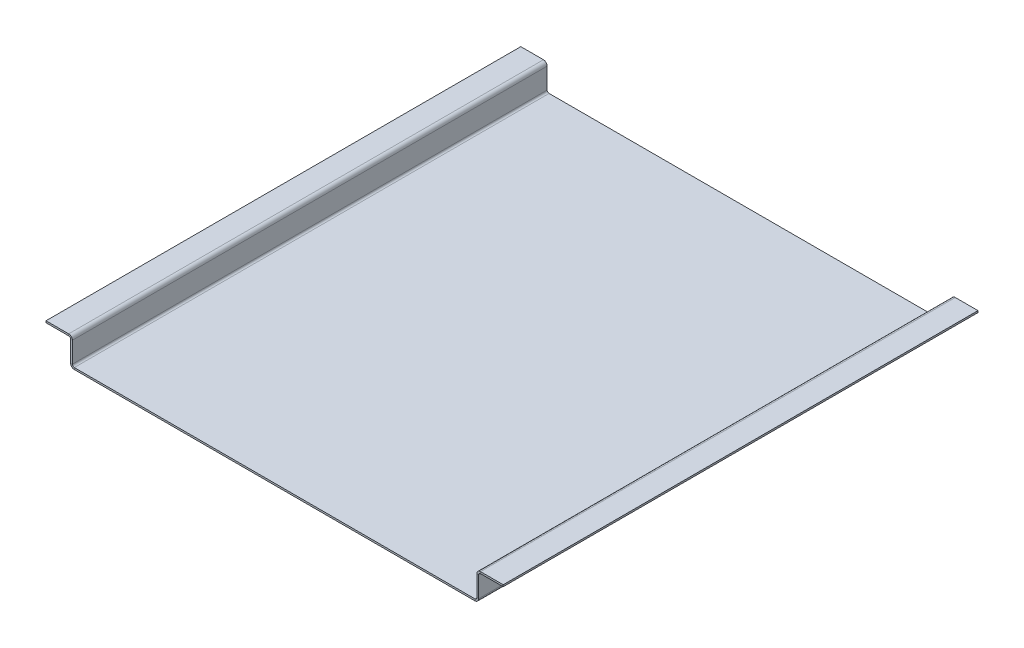
ISO-10303-21;
HEADER;
FILE_DESCRIPTION(('STEP AP214'),'2;1');
FILE_NAME('part.step','',(''),(''),'','','');
FILE_SCHEMA(('AUTOMOTIVE_DESIGN { 1 0 10303 214 1 1 1 1 }'));
ENDSEC;
DATA;
#1=APPLICATION_CONTEXT('core data for automotive mechanical design processes');
#2=APPLICATION_PROTOCOL_DEFINITION('international standard','automotive_design',2000,#1);
#3=PRODUCT_CONTEXT('',#1,'mechanical');
#4=PRODUCT('Part','Part','',(#3));
#5=PRODUCT_RELATED_PRODUCT_CATEGORY('part','',(#4));
#6=PRODUCT_DEFINITION_FORMATION('','',#4);
#7=PRODUCT_DEFINITION_CONTEXT('part definition',#1,'design');
#8=PRODUCT_DEFINITION('design','',#6,#7);
#9=PRODUCT_DEFINITION_SHAPE('','',#8);
#10=(LENGTH_UNIT() NAMED_UNIT(*) SI_UNIT(.MILLI.,.METRE.));
#11=(NAMED_UNIT(*) PLANE_ANGLE_UNIT() SI_UNIT($,.RADIAN.));
#12=(NAMED_UNIT(*) SI_UNIT($,.STERADIAN.) SOLID_ANGLE_UNIT());
#13=UNCERTAINTY_MEASURE_WITH_UNIT(LENGTH_MEASURE(1.E-05),#10,'distance_accuracy_value','');
#14=(GEOMETRIC_REPRESENTATION_CONTEXT(3) GLOBAL_UNCERTAINTY_ASSIGNED_CONTEXT((#13)) GLOBAL_UNIT_ASSIGNED_CONTEXT((#10,
#11,#12)) REPRESENTATION_CONTEXT('',''));
#15=CARTESIAN_POINT('',(0.,0.,0.));
#16=DIRECTION('',(0.,0.,1.));
#17=DIRECTION('',(1.,0.,0.));
#18=AXIS2_PLACEMENT_3D('',#15,#16,#17);
#19=CARTESIAN_POINT('',(-57.699950579006,-48.2132250580046,270.));
#20=DIRECTION('',(0.,0.,1.));
#21=DIRECTION('',(1.,0.,0.));
#22=AXIS2_PLACEMENT_3D('',#19,#20,#21);
#23=PLANE('',#22);
#24=DIRECTION('',(-1.,0.,0.));
#25=VECTOR('',#24,1.);
#26=CARTESIAN_POINT('',(-57.699950579006,-48.2132250580046,270.));
#27=LINE('',#26,#25);
#28=CARTESIAN_POINT('',(-57.699950579006,-48.2132250580046,270.));
#29=VERTEX_POINT('',#28);
#30=CARTESIAN_POINT('',(-58.699950579006,-48.2132250580046,270.));
#31=VERTEX_POINT('',#30);
#32=EDGE_CURVE('E11',#29,#31,#27,.T.);
#33=ORIENTED_EDGE('',*,*,#32,.F.);
#34=CARTESIAN_POINT('',(-59.7999505790059,-48.2132250580046,270.));
#35=DIRECTION('',(0.,0.,1.));
#36=DIRECTION('',(1.,0.,0.));
#37=AXIS2_PLACEMENT_3D('',#34,#35,#36);
#38=CIRCLE('',#37,2.1);
#39=CARTESIAN_POINT('',(-59.7999505790059,-46.1132250580046,270.));
#40=VERTEX_POINT('',#39);
#41=EDGE_CURVE('E364',#40,#29,#38,.F.);
#42=ORIENTED_EDGE('',*,*,#41,.F.);
#43=DIRECTION('',(0.,1.,0.));
#44=VECTOR('',#43,1.);
#45=CARTESIAN_POINT('',(-59.7999505790059,-47.1132250580046,270.));
#46=LINE('',#45,#44);
#47=CARTESIAN_POINT('',(-59.7999505790059,-47.1132250580046,270.));
#48=VERTEX_POINT('',#47);
#49=EDGE_CURVE('E43',#48,#40,#46,.T.);
#50=ORIENTED_EDGE('',*,*,#49,.F.);
#51=CARTESIAN_POINT('',(-59.7999505790059,-48.2132250580046,270.));
#52=DIRECTION('',(0.,0.,1.));
#53=DIRECTION('',(1.,0.,0.));
#54=AXIS2_PLACEMENT_3D('',#51,#52,#53);
#55=CIRCLE('',#54,1.1);
#56=EDGE_CURVE('E377',#48,#31,#55,.F.);
#57=ORIENTED_EDGE('',*,*,#56,.T.);
#58=EDGE_LOOP('',(#33,#42,#50,#57));
#59=FACE_BOUND('',#58,.T.);
#60=ADVANCED_FACE('F35',(#59),#23,.T.);
#61=CARTESIAN_POINT('',(-59.7999505790059,-47.1132250580046,270.));
#62=DIRECTION('',(0.,0.,1.));
#63=DIRECTION('',(1.,0.,0.));
#64=AXIS2_PLACEMENT_3D('',#61,#62,#63);
#65=PLANE('',#64);
#66=DIRECTION('',(0.,-1.,0.));
#67=VECTOR('',#66,1.);
#68=CARTESIAN_POINT('',(-57.699950579006,-46.1132250580046,270.));
#69=LINE('',#68,#67);
#70=CARTESIAN_POINT('',(-57.699950579006,-60.0132250580046,270.));
#71=VERTEX_POINT('',#70);
#72=EDGE_CURVE('E368',#29,#71,#69,.T.);
#73=ORIENTED_EDGE('',*,*,#72,.F.);
#74=ORIENTED_EDGE('',*,*,#32,.T.);
#75=DIRECTION('',(0.,-1.,0.));
#76=VECTOR('',#75,1.);
#77=CARTESIAN_POINT('',(-58.699950579006,-46.1132250580046,270.));
#78=LINE('',#77,#76);
#79=CARTESIAN_POINT('',(-58.699950579006,-60.0132250580046,270.));
#80=VERTEX_POINT('',#79);
#81=EDGE_CURVE('E379',#31,#80,#78,.T.);
#82=ORIENTED_EDGE('',*,*,#81,.T.);
#83=DIRECTION('',(1.,0.,0.));
#84=VECTOR('',#83,1.);
#85=CARTESIAN_POINT('',(-58.699950579006,-60.0132250580046,270.));
#86=LINE('',#85,#84);
#87=EDGE_CURVE('E338',#80,#71,#86,.T.);
#88=ORIENTED_EDGE('',*,*,#87,.T.);
#89=EDGE_LOOP('',(#73,#74,#82,#88));
#90=FACE_BOUND('',#89,.T.);
#91=ADVANCED_FACE('F448',(#90),#65,.T.);
#92=CARTESIAN_POINT('',(-59.7999505790059,-46.1132250580046,0.));
#93=DIRECTION('',(0.,0.,-1.));
#94=DIRECTION('',(-1.,0.,0.));
#95=AXIS2_PLACEMENT_3D('',#92,#93,#94);
#96=PLANE('',#95);
#97=DIRECTION('',(0.,-1.,0.));
#98=VECTOR('',#97,1.);
#99=CARTESIAN_POINT('',(-59.7999505790059,-46.1132250580046,0.));
#100=LINE('',#99,#98);
#101=CARTESIAN_POINT('',(-59.7999505790059,-46.1132250580046,0.));
#102=VERTEX_POINT('',#101);
#103=CARTESIAN_POINT('',(-59.7999505790059,-47.1132250580046,0.));
#104=VERTEX_POINT('',#103);
#105=EDGE_CURVE('E344',#102,#104,#100,.T.);
#106=ORIENTED_EDGE('',*,*,#105,.F.);
#107=CARTESIAN_POINT('',(-59.7999505790059,-48.2132250580046,0.));
#108=DIRECTION('',(0.,0.,1.));
#109=DIRECTION('',(1.,0.,0.));
#110=AXIS2_PLACEMENT_3D('',#107,#108,#109);
#111=CIRCLE('',#110,2.1);
#112=CARTESIAN_POINT('',(-57.699950579006,-48.2132250580046,0.));
#113=VERTEX_POINT('',#112);
#114=EDGE_CURVE('E248',#102,#113,#111,.F.);
#115=ORIENTED_EDGE('',*,*,#114,.T.);
#116=DIRECTION('',(1.,0.,0.));
#117=VECTOR('',#116,1.);
#118=CARTESIAN_POINT('',(-58.699950579006,-48.2132250580046,0.));
#119=LINE('',#118,#117);
#120=CARTESIAN_POINT('',(-58.699950579006,-48.2132250580046,0.));
#121=VERTEX_POINT('',#120);
#122=EDGE_CURVE('E342',#121,#113,#119,.T.);
#123=ORIENTED_EDGE('',*,*,#122,.F.);
#124=CARTESIAN_POINT('',(-59.7999505790059,-48.2132250580046,0.));
#125=DIRECTION('',(0.,0.,1.));
#126=DIRECTION('',(1.,0.,0.));
#127=AXIS2_PLACEMENT_3D('',#124,#125,#126);
#128=CIRCLE('',#127,1.1);
#129=EDGE_CURVE('E260',#104,#121,#128,.F.);
#130=ORIENTED_EDGE('',*,*,#129,.F.);
#131=EDGE_LOOP('',(#106,#115,#123,#130));
#132=FACE_BOUND('',#131,.T.);
#133=ADVANCED_FACE('F490',(#132),#96,.T.);
#134=CARTESIAN_POINT('',(-58.699950579006,-48.2132250580046,0.));
#135=DIRECTION('',(0.,0.,-1.));
#136=DIRECTION('',(-1.,0.,0.));
#137=AXIS2_PLACEMENT_3D('',#134,#135,#136);
#138=PLANE('',#137);
#139=DIRECTION('',(1.,0.,0.));
#140=VECTOR('',#139,1.);
#141=CARTESIAN_POINT('',(-72.6999505790059,-46.1132250580046,0.));
#142=LINE('',#141,#140);
#143=CARTESIAN_POINT('',(-72.6999505790059,-46.1132250580046,0.));
#144=VERTEX_POINT('',#143);
#145=EDGE_CURVE('E251',#144,#102,#142,.T.);
#146=ORIENTED_EDGE('',*,*,#145,.T.);
#147=ORIENTED_EDGE('',*,*,#105,.T.);
#148=DIRECTION('',(1.,0.,0.));
#149=VECTOR('',#148,1.);
#150=CARTESIAN_POINT('',(-72.6999505790059,-47.1132250580046,0.));
#151=LINE('',#150,#149);
#152=CARTESIAN_POINT('',(-72.6999505790059,-47.1132250580046,0.));
#153=VERTEX_POINT('',#152);
#154=EDGE_CURVE('E257',#153,#104,#151,.T.);
#155=ORIENTED_EDGE('',*,*,#154,.F.);
#156=DIRECTION('',(0.,1.,0.));
#157=VECTOR('',#156,1.);
#158=CARTESIAN_POINT('',(-72.6999505790059,-47.1132250580046,0.));
#159=LINE('',#158,#157);
#160=EDGE_CURVE('E254',#153,#144,#159,.T.);
#161=ORIENTED_EDGE('',*,*,#160,.T.);
#162=EDGE_LOOP('',(#146,#147,#155,#161));
#163=FACE_BOUND('',#162,.T.);
#164=ADVANCED_FACE('F494',(#163),#138,.T.);
#165=CARTESIAN_POINT('',(-56.599950579006,-61.1132250580046,270.));
#166=DIRECTION('',(0.,0.,1.));
#167=DIRECTION('',(1.,0.,0.));
#168=AXIS2_PLACEMENT_3D('',#165,#166,#167);
#169=PLANE('',#168);
#170=DIRECTION('',(0.,-1.,0.));
#171=VECTOR('',#170,1.);
#172=CARTESIAN_POINT('',(-56.599950579006,-61.1132250580046,270.));
#173=LINE('',#172,#171);
#174=CARTESIAN_POINT('',(-56.599950579006,-61.1132250580046,270.));
#175=VERTEX_POINT('',#174);
#176=CARTESIAN_POINT('',(-56.599950579006,-62.1132250580046,270.));
#177=VERTEX_POINT('',#176);
#178=EDGE_CURVE('E340',#175,#177,#173,.T.);
#179=ORIENTED_EDGE('',*,*,#178,.F.);
#180=CARTESIAN_POINT('',(-56.599950579006,-60.0132250580046,270.));
#181=DIRECTION('',(0.,0.,-1.));
#182=DIRECTION('',(-1.,0.,0.));
#183=AXIS2_PLACEMENT_3D('',#180,#181,#182);
#184=CIRCLE('',#183,1.1);
#185=EDGE_CURVE('E438',#71,#175,#184,.F.);
#186=ORIENTED_EDGE('',*,*,#185,.F.);
#187=ORIENTED_EDGE('',*,*,#87,.F.);
#188=CARTESIAN_POINT('',(-56.599950579006,-60.0132250580046,270.));
#189=DIRECTION('',(0.,0.,1.));
#190=DIRECTION('',(1.,0.,0.));
#191=AXIS2_PLACEMENT_3D('',#188,#189,#190);
#192=CIRCLE('',#191,2.1);
#193=EDGE_CURVE('E382',#80,#177,#192,.T.);
#194=ORIENTED_EDGE('',*,*,#193,.T.);
#195=EDGE_LOOP('',(#179,#186,#187,#194));
#196=FACE_BOUND('',#195,.T.);
#197=ADVANCED_FACE('F455',(#196),#169,.T.);
#198=CARTESIAN_POINT('',(-58.699950579006,-60.0132250580046,270.));
#199=DIRECTION('',(0.,0.,1.));
#200=DIRECTION('',(1.,0.,0.));
#201=AXIS2_PLACEMENT_3D('',#198,#199,#200);
#202=PLANE('',#201);
#203=DIRECTION('',(1.,0.,0.));
#204=VECTOR('',#203,1.);
#205=CARTESIAN_POINT('',(-57.699950579006,-61.1132250580046,270.));
#206=LINE('',#205,#204);
#207=CARTESIAN_POINT('',(171.200049420994,-61.1132250580046,270.));
#208=VERTEX_POINT('',#207);
#209=EDGE_CURVE('E435',#175,#208,#206,.T.);
#210=ORIENTED_EDGE('',*,*,#209,.F.);
#211=ORIENTED_EDGE('',*,*,#178,.T.);
#212=DIRECTION('',(1.,0.,0.));
#213=VECTOR('',#212,1.);
#214=CARTESIAN_POINT('',(-57.699950579006,-62.1132250580046,270.));
#215=LINE('',#214,#213);
#216=CARTESIAN_POINT('',(171.200049420994,-62.1132250580046,270.));
#217=VERTEX_POINT('',#216);
#218=EDGE_CURVE('E202',#177,#217,#215,.T.);
#219=ORIENTED_EDGE('',*,*,#218,.T.);
#220=DIRECTION('',(0.,1.,0.));
#221=VECTOR('',#220,1.);
#222=CARTESIAN_POINT('',(171.200049420994,-62.1132250580046,270.));
#223=LINE('',#222,#221);
#224=EDGE_CURVE('E193',#217,#208,#223,.T.);
#225=ORIENTED_EDGE('',*,*,#224,.T.);
#226=EDGE_LOOP('',(#210,#211,#219,#225));
#227=FACE_BOUND('',#226,.T.);
#228=ADVANCED_FACE('F388',(#227),#202,.T.);
#229=CARTESIAN_POINT('',(-57.699950579006,-60.0132250580046,0.));
#230=DIRECTION('',(0.,0.,-1.));
#231=DIRECTION('',(-1.,0.,0.));
#232=AXIS2_PLACEMENT_3D('',#229,#230,#231);
#233=PLANE('',#232);
#234=DIRECTION('',(-1.,0.,0.));
#235=VECTOR('',#234,1.);
#236=CARTESIAN_POINT('',(-57.699950579006,-60.0132250580046,0.));
#237=LINE('',#236,#235);
#238=CARTESIAN_POINT('',(-57.699950579006,-60.0132250580046,0.));
#239=VERTEX_POINT('',#238);
#240=CARTESIAN_POINT('',(-58.699950579006,-60.0132250580046,0.));
#241=VERTEX_POINT('',#240);
#242=EDGE_CURVE('E336',#239,#241,#237,.T.);
#243=ORIENTED_EDGE('',*,*,#242,.F.);
#244=CARTESIAN_POINT('',(-56.599950579006,-60.0132250580046,0.));
#245=DIRECTION('',(0.,0.,-1.));
#246=DIRECTION('',(-1.,0.,0.));
#247=AXIS2_PLACEMENT_3D('',#244,#245,#246);
#248=CIRCLE('',#247,1.1);
#249=CARTESIAN_POINT('',(-56.599950579006,-61.1132250580046,0.));
#250=VERTEX_POINT('',#249);
#251=EDGE_CURVE('E242',#239,#250,#248,.F.);
#252=ORIENTED_EDGE('',*,*,#251,.T.);
#253=DIRECTION('',(0.,1.,0.));
#254=VECTOR('',#253,1.);
#255=CARTESIAN_POINT('',(-56.599950579006,-62.1132250580046,0.));
#256=LINE('',#255,#254);
#257=CARTESIAN_POINT('',(-56.599950579006,-62.1132250580046,0.));
#258=VERTEX_POINT('',#257);
#259=EDGE_CURVE('E192',#258,#250,#256,.T.);
#260=ORIENTED_EDGE('',*,*,#259,.F.);
#261=CARTESIAN_POINT('',(-56.599950579006,-60.0132250580046,0.));
#262=DIRECTION('',(0.,0.,1.));
#263=DIRECTION('',(1.,0.,0.));
#264=AXIS2_PLACEMENT_3D('',#261,#262,#263);
#265=CIRCLE('',#264,2.1);
#266=EDGE_CURVE('E266',#241,#258,#265,.T.);
#267=ORIENTED_EDGE('',*,*,#266,.F.);
#268=EDGE_LOOP('',(#243,#252,#260,#267));
#269=FACE_BOUND('',#268,.T.);
#270=ADVANCED_FACE('F464',(#269),#233,.T.);
#271=CARTESIAN_POINT('',(-56.599950579006,-62.1132250580046,0.));
#272=DIRECTION('',(0.,0.,-1.));
#273=DIRECTION('',(-1.,0.,0.));
#274=AXIS2_PLACEMENT_3D('',#271,#272,#273);
#275=PLANE('',#274);
#276=DIRECTION('',(0.,-1.,0.));
#277=VECTOR('',#276,1.);
#278=CARTESIAN_POINT('',(-57.699950579006,-46.1132250580046,0.));
#279=LINE('',#278,#277);
#280=EDGE_CURVE('E245',#113,#239,#279,.T.);
#281=ORIENTED_EDGE('',*,*,#280,.T.);
#282=ORIENTED_EDGE('',*,*,#242,.T.);
#283=DIRECTION('',(0.,-1.,0.));
#284=VECTOR('',#283,1.);
#285=CARTESIAN_POINT('',(-58.699950579006,-46.1132250580046,0.));
#286=LINE('',#285,#284);
#287=EDGE_CURVE('E263',#121,#241,#286,.T.);
#288=ORIENTED_EDGE('',*,*,#287,.F.);
#289=ORIENTED_EDGE('',*,*,#122,.T.);
#290=EDGE_LOOP('',(#281,#282,#288,#289));
#291=FACE_BOUND('',#290,.T.);
#292=ADVANCED_FACE('F468',(#291),#275,.T.);
#293=CARTESIAN_POINT('',(172.300049420994,-60.0132250580046,270.));
#294=DIRECTION('',(0.,0.,1.));
#295=DIRECTION('',(1.,0.,0.));
#296=AXIS2_PLACEMENT_3D('',#293,#294,#295);
#297=PLANE('',#296);
#298=DIRECTION('',(1.,0.,0.));
#299=VECTOR('',#298,1.);
#300=CARTESIAN_POINT('',(172.300049420994,-60.0132250580046,270.));
#301=LINE('',#300,#299);
#302=CARTESIAN_POINT('',(172.300049420994,-60.0132250580046,270.));
#303=VERTEX_POINT('',#302);
#304=CARTESIAN_POINT('',(173.300049420994,-60.0132250580046,270.));
#305=VERTEX_POINT('',#304);
#306=EDGE_CURVE('E180',#303,#305,#301,.T.);
#307=ORIENTED_EDGE('',*,*,#306,.F.);
#308=CARTESIAN_POINT('',(171.200049420994,-60.0132250580046,270.));
#309=DIRECTION('',(0.,0.,-1.));
#310=DIRECTION('',(-1.,0.,0.));
#311=AXIS2_PLACEMENT_3D('',#308,#309,#310);
#312=CIRCLE('',#311,1.1);
#313=EDGE_CURVE('E400',#208,#303,#312,.F.);
#314=ORIENTED_EDGE('',*,*,#313,.F.);
#315=ORIENTED_EDGE('',*,*,#224,.F.);
#316=CARTESIAN_POINT('',(171.200049420994,-60.0132250580046,270.));
#317=DIRECTION('',(0.,0.,1.));
#318=DIRECTION('',(1.,0.,0.));
#319=AXIS2_PLACEMENT_3D('',#316,#317,#318);
#320=CIRCLE('',#319,2.1);
#321=EDGE_CURVE('E196',#217,#305,#320,.T.);
#322=ORIENTED_EDGE('',*,*,#321,.T.);
#323=EDGE_LOOP('',(#307,#314,#315,#322));
#324=FACE_BOUND('',#323,.T.);
#325=ADVANCED_FACE('F198',(#324),#297,.T.);
#326=CARTESIAN_POINT('',(171.200049420994,-62.1132250580046,270.));
#327=DIRECTION('',(0.,0.,1.));
#328=DIRECTION('',(1.,0.,0.));
#329=AXIS2_PLACEMENT_3D('',#326,#327,#328);
#330=PLANE('',#329);
#331=DIRECTION('',(0.,1.,0.));
#332=VECTOR('',#331,1.);
#333=CARTESIAN_POINT('',(172.300049420994,-61.1132250580046,270.));
#334=LINE('',#333,#332);
#335=CARTESIAN_POINT('',(172.300049420994,-48.2132250580046,270.));
#336=VERTEX_POINT('',#335);
#337=EDGE_CURVE('E187',#303,#336,#334,.T.);
#338=ORIENTED_EDGE('',*,*,#337,.F.);
#339=ORIENTED_EDGE('',*,*,#306,.T.);
#340=DIRECTION('',(0.,1.,0.));
#341=VECTOR('',#340,1.);
#342=CARTESIAN_POINT('',(173.300049420994,-61.1132250580046,270.));
#343=LINE('',#342,#341);
#344=CARTESIAN_POINT('',(173.300049420994,-48.2132250580046,270.));
#345=VERTEX_POINT('',#344);
#346=EDGE_CURVE('E184',#305,#345,#343,.T.);
#347=ORIENTED_EDGE('',*,*,#346,.T.);
#348=DIRECTION('',(-1.,0.,0.));
#349=VECTOR('',#348,1.);
#350=CARTESIAN_POINT('',(173.300049420994,-48.2132250580046,270.));
#351=LINE('',#350,#349);
#352=EDGE_CURVE('E327',#345,#336,#351,.T.);
#353=ORIENTED_EDGE('',*,*,#352,.T.);
#354=EDGE_LOOP('',(#338,#339,#347,#353));
#355=FACE_BOUND('',#354,.T.);
#356=ADVANCED_FACE('F182',(#355),#330,.T.);
#357=CARTESIAN_POINT('',(171.200049420994,-61.1132250580046,0.));
#358=DIRECTION('',(0.,0.,-1.));
#359=DIRECTION('',(-1.,0.,0.));
#360=AXIS2_PLACEMENT_3D('',#357,#358,#359);
#361=PLANE('',#360);
#362=DIRECTION('',(0.,-1.,0.));
#363=VECTOR('',#362,1.);
#364=CARTESIAN_POINT('',(171.200049420994,-61.1132250580046,0.));
#365=LINE('',#364,#363);
#366=CARTESIAN_POINT('',(171.200049420994,-61.1132250580046,0.));
#367=VERTEX_POINT('',#366);
#368=CARTESIAN_POINT('',(171.200049420994,-62.1132250580046,0.));
#369=VERTEX_POINT('',#368);
#370=EDGE_CURVE('E332',#367,#369,#365,.T.);
#371=ORIENTED_EDGE('',*,*,#370,.F.);
#372=CARTESIAN_POINT('',(171.200049420994,-60.0132250580046,0.));
#373=DIRECTION('',(0.,0.,-1.));
#374=DIRECTION('',(-1.,0.,0.));
#375=AXIS2_PLACEMENT_3D('',#372,#373,#374);
#376=CIRCLE('',#375,1.1);
#377=CARTESIAN_POINT('',(172.300049420994,-60.0132250580046,0.));
#378=VERTEX_POINT('',#377);
#379=EDGE_CURVE('E236',#367,#378,#376,.F.);
#380=ORIENTED_EDGE('',*,*,#379,.T.);
#381=DIRECTION('',(-1.,0.,0.));
#382=VECTOR('',#381,1.);
#383=CARTESIAN_POINT('',(173.300049420994,-60.0132250580046,0.));
#384=LINE('',#383,#382);
#385=CARTESIAN_POINT('',(173.300049420994,-60.0132250580046,0.));
#386=VERTEX_POINT('',#385);
#387=EDGE_CURVE('E330',#386,#378,#384,.T.);
#388=ORIENTED_EDGE('',*,*,#387,.F.);
#389=CARTESIAN_POINT('',(171.200049420994,-60.0132250580046,0.));
#390=DIRECTION('',(0.,0.,1.));
#391=DIRECTION('',(1.,0.,0.));
#392=AXIS2_PLACEMENT_3D('',#389,#390,#391);
#393=CIRCLE('',#392,2.1);
#394=EDGE_CURVE('E209',#369,#386,#393,.T.);
#395=ORIENTED_EDGE('',*,*,#394,.F.);
#396=EDGE_LOOP('',(#371,#380,#388,#395));
#397=FACE_BOUND('',#396,.T.);
#398=ADVANCED_FACE('F394',(#397),#361,.T.);
#399=CARTESIAN_POINT('',(173.300049420994,-60.0132250580046,0.));
#400=DIRECTION('',(0.,0.,-1.));
#401=DIRECTION('',(-1.,0.,0.));
#402=AXIS2_PLACEMENT_3D('',#399,#400,#401);
#403=PLANE('',#402);
#404=DIRECTION('',(1.,0.,0.));
#405=VECTOR('',#404,1.);
#406=CARTESIAN_POINT('',(-57.699950579006,-61.1132250580046,0.));
#407=LINE('',#406,#405);
#408=EDGE_CURVE('E239',#250,#367,#407,.T.);
#409=ORIENTED_EDGE('',*,*,#408,.T.);
#410=ORIENTED_EDGE('',*,*,#370,.T.);
#411=DIRECTION('',(1.,0.,0.));
#412=VECTOR('',#411,1.);
#413=CARTESIAN_POINT('',(-57.699950579006,-62.1132250580046,0.));
#414=LINE('',#413,#412);
#415=EDGE_CURVE('E269',#258,#369,#414,.T.);
#416=ORIENTED_EDGE('',*,*,#415,.F.);
#417=ORIENTED_EDGE('',*,*,#259,.T.);
#418=EDGE_LOOP('',(#409,#410,#416,#417));
#419=FACE_BOUND('',#418,.T.);
#420=ADVANCED_FACE('F474',(#419),#403,.T.);
#421=CARTESIAN_POINT('',(174.400049420994,-46.1132250580046,270.));
#422=DIRECTION('',(0.,0.,1.));
#423=DIRECTION('',(1.,0.,0.));
#424=AXIS2_PLACEMENT_3D('',#421,#422,#423);
#425=PLANE('',#424);
#426=DIRECTION('',(0.,-1.,0.));
#427=VECTOR('',#426,1.);
#428=CARTESIAN_POINT('',(174.400049420994,-46.1132250580046,270.));
#429=LINE('',#428,#427);
#430=CARTESIAN_POINT('',(174.400049420994,-46.1132250580046,270.));
#431=VERTEX_POINT('',#430);
#432=CARTESIAN_POINT('',(174.400049420994,-47.1132250580046,270.));
#433=VERTEX_POINT('',#432);
#434=EDGE_CURVE('E51',#431,#433,#429,.T.);
#435=ORIENTED_EDGE('',*,*,#434,.F.);
#436=CARTESIAN_POINT('',(174.400049420994,-48.2132250580046,270.));
#437=DIRECTION('',(0.,0.,1.));
#438=DIRECTION('',(1.,0.,0.));
#439=AXIS2_PLACEMENT_3D('',#436,#437,#438);
#440=CIRCLE('',#439,2.1);
#441=EDGE_CURVE('E428',#336,#431,#440,.F.);
#442=ORIENTED_EDGE('',*,*,#441,.F.);
#443=ORIENTED_EDGE('',*,*,#352,.F.);
#444=CARTESIAN_POINT('',(174.400049420994,-48.2132250580046,270.));
#445=DIRECTION('',(0.,0.,1.));
#446=DIRECTION('',(1.,0.,0.));
#447=AXIS2_PLACEMENT_3D('',#444,#445,#446);
#448=CIRCLE('',#447,1.1);
#449=EDGE_CURVE('E217',#345,#433,#448,.F.);
#450=ORIENTED_EDGE('',*,*,#449,.T.);
#451=EDGE_LOOP('',(#435,#442,#443,#450));
#452=FACE_BOUND('',#451,.T.);
#453=ADVANCED_FACE('F476',(#452),#425,.T.);
#454=CARTESIAN_POINT('',(173.300049420994,-48.2132250580046,270.));
#455=DIRECTION('',(0.,0.,1.));
#456=DIRECTION('',(1.,0.,0.));
#457=AXIS2_PLACEMENT_3D('',#454,#455,#456);
#458=PLANE('',#457);
#459=DIRECTION('',(1.,0.,0.));
#460=VECTOR('',#459,1.);
#461=CARTESIAN_POINT('',(172.300049420994,-46.1132250580046,270.));
#462=LINE('',#461,#460);
#463=CARTESIAN_POINT('',(187.300049420994,-46.1132250580046,270.));
#464=VERTEX_POINT('',#463);
#465=EDGE_CURVE('E426',#431,#464,#462,.T.);
#466=ORIENTED_EDGE('',*,*,#465,.F.);
#467=ORIENTED_EDGE('',*,*,#434,.T.);
#468=DIRECTION('',(1.,0.,0.));
#469=VECTOR('',#468,1.);
#470=CARTESIAN_POINT('',(172.300049420994,-47.1132250580046,270.));
#471=LINE('',#470,#469);
#472=CARTESIAN_POINT('',(187.300049420994,-47.1132250580046,270.));
#473=VERTEX_POINT('',#472);
#474=EDGE_CURVE('E129',#433,#473,#471,.T.);
#475=ORIENTED_EDGE('',*,*,#474,.T.);
#476=DIRECTION('',(0.,-1.,0.));
#477=VECTOR('',#476,1.);
#478=CARTESIAN_POINT('',(187.300049420994,-46.1132250580046,270.));
#479=LINE('',#478,#477);
#480=EDGE_CURVE('E424',#464,#473,#479,.T.);
#481=ORIENTED_EDGE('',*,*,#480,.F.);
#482=EDGE_LOOP('',(#466,#467,#475,#481));
#483=FACE_BOUND('',#482,.T.);
#484=ADVANCED_FACE('F482',(#483),#458,.T.);
#485=CARTESIAN_POINT('',(172.300049420994,-48.2132250580046,0.));
#486=DIRECTION('',(0.,0.,-1.));
#487=DIRECTION('',(-1.,0.,0.));
#488=AXIS2_PLACEMENT_3D('',#485,#486,#487);
#489=PLANE('',#488);
#490=DIRECTION('',(1.,0.,0.));
#491=VECTOR('',#490,1.);
#492=CARTESIAN_POINT('',(172.300049420994,-48.2132250580046,0.));
#493=LINE('',#492,#491);
#494=CARTESIAN_POINT('',(172.300049420994,-48.2132250580046,0.));
#495=VERTEX_POINT('',#494);
#496=CARTESIAN_POINT('',(173.300049420994,-48.2132250580046,0.));
#497=VERTEX_POINT('',#496);
#498=EDGE_CURVE('E116',#495,#497,#493,.T.);
#499=ORIENTED_EDGE('',*,*,#498,.F.);
#500=CARTESIAN_POINT('',(174.400049420994,-48.2132250580046,0.));
#501=DIRECTION('',(0.,0.,1.));
#502=DIRECTION('',(1.,0.,0.));
#503=AXIS2_PLACEMENT_3D('',#500,#501,#502);
#504=CIRCLE('',#503,2.1);
#505=CARTESIAN_POINT('',(174.400049420994,-46.1132250580046,0.));
#506=VERTEX_POINT('',#505);
#507=EDGE_CURVE('E232',#495,#506,#504,.F.);
#508=ORIENTED_EDGE('',*,*,#507,.T.);
#509=DIRECTION('',(0.,1.,0.));
#510=VECTOR('',#509,1.);
#511=CARTESIAN_POINT('',(174.400049420994,-47.1132250580046,0.));
#512=LINE('',#511,#510);
#513=CARTESIAN_POINT('',(174.400049420994,-47.1132250580046,0.));
#514=VERTEX_POINT('',#513);
#515=EDGE_CURVE('E123',#514,#506,#512,.T.);
#516=ORIENTED_EDGE('',*,*,#515,.F.);
#517=CARTESIAN_POINT('',(174.400049420994,-48.2132250580046,0.));
#518=DIRECTION('',(0.,0.,1.));
#519=DIRECTION('',(1.,0.,0.));
#520=AXIS2_PLACEMENT_3D('',#517,#518,#519);
#521=CIRCLE('',#520,1.1);
#522=EDGE_CURVE('E275',#497,#514,#521,.F.);
#523=ORIENTED_EDGE('',*,*,#522,.F.);
#524=EDGE_LOOP('',(#499,#508,#516,#523));
#525=FACE_BOUND('',#524,.T.);
#526=ADVANCED_FACE('F411',(#525),#489,.T.);
#527=CARTESIAN_POINT('',(174.400049420994,-47.1132250580046,0.));
#528=DIRECTION('',(0.,0.,-1.));
#529=DIRECTION('',(-1.,0.,0.));
#530=AXIS2_PLACEMENT_3D('',#527,#528,#529);
#531=PLANE('',#530);
#532=DIRECTION('',(0.,1.,0.));
#533=VECTOR('',#532,1.);
#534=CARTESIAN_POINT('',(172.300049420994,-61.1132250580046,0.));
#535=LINE('',#534,#533);
#536=EDGE_CURVE('E234',#378,#495,#535,.T.);
#537=ORIENTED_EDGE('',*,*,#536,.T.);
#538=ORIENTED_EDGE('',*,*,#498,.T.);
#539=DIRECTION('',(0.,1.,0.));
#540=VECTOR('',#539,1.);
#541=CARTESIAN_POINT('',(173.300049420994,-61.1132250580046,0.));
#542=LINE('',#541,#540);
#543=EDGE_CURVE('E273',#386,#497,#542,.T.);
#544=ORIENTED_EDGE('',*,*,#543,.F.);
#545=ORIENTED_EDGE('',*,*,#387,.T.);
#546=EDGE_LOOP('',(#537,#538,#544,#545));
#547=FACE_BOUND('',#546,.T.);
#548=ADVANCED_FACE('F396',(#547),#531,.T.);
#549=CARTESIAN_POINT('',(172.300049420994,-47.1132250580046,270.));
#550=DIRECTION('',(0.,1.,0.));
#551=DIRECTION('',(0.,0.,1.));
#552=AXIS2_PLACEMENT_3D('',#549,#550,#551);
#553=PLANE('',#552);
#554=DIRECTION('',(1.,0.,0.));
#555=VECTOR('',#554,1.);
#556=CARTESIAN_POINT('',(172.300049420994,-47.1132250580046,0.));
#557=LINE('',#556,#555);
#558=CARTESIAN_POINT('',(187.300049420994,-47.1132250580046,0.));
#559=VERTEX_POINT('',#558);
#560=EDGE_CURVE('E223',#514,#559,#557,.T.);
#561=ORIENTED_EDGE('',*,*,#560,.T.);
#562=DIRECTION('',(0.,0.,-1.));
#563=VECTOR('',#562,1.);
#564=CARTESIAN_POINT('',(187.300049420994,-47.1132250580046,270.));
#565=LINE('',#564,#563);
#566=EDGE_CURVE('E323',#473,#559,#565,.T.);
#567=ORIENTED_EDGE('',*,*,#566,.F.);
#568=ORIENTED_EDGE('',*,*,#474,.F.);
#569=DIRECTION('',(0.,0.,-1.));
#570=VECTOR('',#569,1.);
#571=CARTESIAN_POINT('',(174.400049420994,-47.1132250580046,270.));
#572=LINE('',#571,#570);
#573=EDGE_CURVE('E219',#433,#514,#572,.T.);
#574=ORIENTED_EDGE('',*,*,#573,.T.);
#575=EDGE_LOOP('',(#561,#567,#568,#574));
#576=FACE_BOUND('',#575,.T.);
#577=ADVANCED_FACE('F417',(#576),#553,.F.);
#578=CARTESIAN_POINT('',(187.300049420994,-46.1132250580046,270.));
#579=DIRECTION('',(1.,0.,0.));
#580=DIRECTION('',(0.,0.,-1.));
#581=AXIS2_PLACEMENT_3D('',#578,#579,#580);
#582=PLANE('',#581);
#583=DIRECTION('',(0.,-1.,0.));
#584=VECTOR('',#583,1.);
#585=CARTESIAN_POINT('',(187.300049420994,-46.1132250580046,0.));
#586=LINE('',#585,#584);
#587=CARTESIAN_POINT('',(187.300049420994,-46.1132250580046,0.));
#588=VERTEX_POINT('',#587);
#589=EDGE_CURVE('E226',#588,#559,#586,.T.);
#590=ORIENTED_EDGE('',*,*,#589,.F.);
#591=DIRECTION('',(0.,0.,-1.));
#592=VECTOR('',#591,1.);
#593=CARTESIAN_POINT('',(187.300049420994,-46.1132250580046,270.));
#594=LINE('',#593,#592);
#595=EDGE_CURVE('E321',#464,#588,#594,.T.);
#596=ORIENTED_EDGE('',*,*,#595,.F.);
#597=ORIENTED_EDGE('',*,*,#480,.T.);
#598=ORIENTED_EDGE('',*,*,#566,.T.);
#599=EDGE_LOOP('',(#590,#596,#597,#598));
#600=FACE_BOUND('',#599,.T.);
#601=ADVANCED_FACE('F422',(#600),#582,.T.);
#602=CARTESIAN_POINT('',(172.300049420994,-46.1132250580046,270.));
#603=DIRECTION('',(0.,1.,0.));
#604=DIRECTION('',(0.,0.,1.));
#605=AXIS2_PLACEMENT_3D('',#602,#603,#604);
#606=PLANE('',#605);
#607=DIRECTION('',(1.,0.,0.));
#608=VECTOR('',#607,1.);
#609=CARTESIAN_POINT('',(172.300049420994,-46.1132250580046,0.));
#610=LINE('',#609,#608);
#611=EDGE_CURVE('E229',#506,#588,#610,.T.);
#612=ORIENTED_EDGE('',*,*,#611,.F.);
#613=DIRECTION('',(0.,0.,-1.));
#614=VECTOR('',#613,1.);
#615=CARTESIAN_POINT('',(174.400049420994,-46.1132250580046,270.));
#616=LINE('',#615,#614);
#617=EDGE_CURVE('E318',#431,#506,#616,.T.);
#618=ORIENTED_EDGE('',*,*,#617,.F.);
#619=ORIENTED_EDGE('',*,*,#465,.T.);
#620=ORIENTED_EDGE('',*,*,#595,.T.);
#621=EDGE_LOOP('',(#612,#618,#619,#620));
#622=FACE_BOUND('',#621,.T.);
#623=ADVANCED_FACE('F578',(#622),#606,.T.);
#624=CARTESIAN_POINT('',(174.400049420994,-48.2132250580046,270.));
#625=DIRECTION('',(0.,0.,-1.));
#626=DIRECTION('',(-1.,0.,0.));
#627=AXIS2_PLACEMENT_3D('',#624,#625,#626);
#628=CYLINDRICAL_SURFACE('',#627,2.1);
#629=ORIENTED_EDGE('',*,*,#507,.F.);
#630=DIRECTION('',(0.,0.,-1.));
#631=VECTOR('',#630,1.);
#632=CARTESIAN_POINT('',(172.300049420994,-48.2132250580046,270.));
#633=LINE('',#632,#631);
#634=EDGE_CURVE('E315',#336,#495,#633,.T.);
#635=ORIENTED_EDGE('',*,*,#634,.F.);
#636=ORIENTED_EDGE('',*,*,#441,.T.);
#637=ORIENTED_EDGE('',*,*,#617,.T.);
#638=EDGE_LOOP('',(#629,#635,#636,#637));
#639=FACE_BOUND('',#638,.T.);
#640=ADVANCED_FACE('F408',(#639),#628,.T.);
#641=CARTESIAN_POINT('',(172.300049420994,-61.1132250580046,270.));
#642=DIRECTION('',(-1.,0.,0.));
#643=DIRECTION('',(0.,0.,1.));
#644=AXIS2_PLACEMENT_3D('',#641,#642,#643);
#645=PLANE('',#644);
#646=ORIENTED_EDGE('',*,*,#536,.F.);
#647=DIRECTION('',(0.,0.,-1.));
#648=VECTOR('',#647,1.);
#649=CARTESIAN_POINT('',(172.300049420994,-60.0132250580046,270.));
#650=LINE('',#649,#648);
#651=EDGE_CURVE('E312',#303,#378,#650,.T.);
#652=ORIENTED_EDGE('',*,*,#651,.F.);
#653=ORIENTED_EDGE('',*,*,#337,.T.);
#654=ORIENTED_EDGE('',*,*,#634,.T.);
#655=EDGE_LOOP('',(#646,#652,#653,#654));
#656=FACE_BOUND('',#655,.T.);
#657=ADVANCED_FACE('F402',(#656),#645,.T.);
#658=CARTESIAN_POINT('',(171.200049420994,-60.0132250580046,270.));
#659=DIRECTION('',(0.,0.,-1.));
#660=DIRECTION('',(-1.,0.,0.));
#661=AXIS2_PLACEMENT_3D('',#658,#659,#660);
#662=CYLINDRICAL_SURFACE('',#661,1.1);
#663=ORIENTED_EDGE('',*,*,#379,.F.);
#664=DIRECTION('',(0.,0.,-1.));
#665=VECTOR('',#664,1.);
#666=CARTESIAN_POINT('',(171.200049420994,-61.1132250580046,270.));
#667=LINE('',#666,#665);
#668=EDGE_CURVE('E309',#208,#367,#667,.T.);
#669=ORIENTED_EDGE('',*,*,#668,.F.);
#670=ORIENTED_EDGE('',*,*,#313,.T.);
#671=ORIENTED_EDGE('',*,*,#651,.T.);
#672=EDGE_LOOP('',(#663,#669,#670,#671));
#673=FACE_BOUND('',#672,.T.);
#674=ADVANCED_FACE('F399',(#673),#662,.F.);
#675=CARTESIAN_POINT('',(-57.699950579006,-61.1132250580046,270.));
#676=DIRECTION('',(0.,1.,0.));
#677=DIRECTION('',(0.,0.,1.));
#678=AXIS2_PLACEMENT_3D('',#675,#676,#677);
#679=PLANE('',#678);
#680=ORIENTED_EDGE('',*,*,#408,.F.);
#681=DIRECTION('',(0.,0.,-1.));
#682=VECTOR('',#681,1.);
#683=CARTESIAN_POINT('',(-56.599950579006,-61.1132250580046,270.));
#684=LINE('',#683,#682);
#685=EDGE_CURVE('E306',#175,#250,#684,.T.);
#686=ORIENTED_EDGE('',*,*,#685,.F.);
#687=ORIENTED_EDGE('',*,*,#209,.T.);
#688=ORIENTED_EDGE('',*,*,#668,.T.);
#689=EDGE_LOOP('',(#680,#686,#687,#688));
#690=FACE_BOUND('',#689,.T.);
#691=ADVANCED_FACE('F461',(#690),#679,.T.);
#692=CARTESIAN_POINT('',(-56.599950579006,-60.0132250580046,270.));
#693=DIRECTION('',(0.,0.,-1.));
#694=DIRECTION('',(-1.,0.,0.));
#695=AXIS2_PLACEMENT_3D('',#692,#693,#694);
#696=CYLINDRICAL_SURFACE('',#695,1.1);
#697=ORIENTED_EDGE('',*,*,#251,.F.);
#698=DIRECTION('',(0.,0.,-1.));
#699=VECTOR('',#698,1.);
#700=CARTESIAN_POINT('',(-57.699950579006,-60.0132250580046,270.));
#701=LINE('',#700,#699);
#702=EDGE_CURVE('E303',#71,#239,#701,.T.);
#703=ORIENTED_EDGE('',*,*,#702,.F.);
#704=ORIENTED_EDGE('',*,*,#185,.T.);
#705=ORIENTED_EDGE('',*,*,#685,.T.);
#706=EDGE_LOOP('',(#697,#703,#704,#705));
#707=FACE_BOUND('',#706,.T.);
#708=ADVANCED_FACE('F454',(#707),#696,.F.);
#709=CARTESIAN_POINT('',(-57.699950579006,-46.1132250580046,270.));
#710=DIRECTION('',(1.,0.,0.));
#711=DIRECTION('',(0.,1.,0.));
#712=AXIS2_PLACEMENT_3D('',#709,#710,#711);
#713=PLANE('',#712);
#714=ORIENTED_EDGE('',*,*,#280,.F.);
#715=DIRECTION('',(0.,0.,-1.));
#716=VECTOR('',#715,1.);
#717=CARTESIAN_POINT('',(-57.699950579006,-48.2132250580046,270.));
#718=LINE('',#717,#716);
#719=EDGE_CURVE('E300',#29,#113,#718,.T.);
#720=ORIENTED_EDGE('',*,*,#719,.F.);
#721=ORIENTED_EDGE('',*,*,#72,.T.);
#722=ORIENTED_EDGE('',*,*,#702,.T.);
#723=EDGE_LOOP('',(#714,#720,#721,#722));
#724=FACE_BOUND('',#723,.T.);
#725=ADVANCED_FACE('F444',(#724),#713,.T.);
#726=CARTESIAN_POINT('',(-59.7999505790059,-48.2132250580046,270.));
#727=DIRECTION('',(0.,0.,-1.));
#728=DIRECTION('',(-1.,0.,0.));
#729=AXIS2_PLACEMENT_3D('',#726,#727,#728);
#730=CYLINDRICAL_SURFACE('',#729,2.1);
#731=ORIENTED_EDGE('',*,*,#114,.F.);
#732=DIRECTION('',(0.,0.,-1.));
#733=VECTOR('',#732,1.);
#734=CARTESIAN_POINT('',(-59.7999505790059,-46.1132250580046,270.));
#735=LINE('',#734,#733);
#736=EDGE_CURVE('E297',#40,#102,#735,.T.);
#737=ORIENTED_EDGE('',*,*,#736,.F.);
#738=ORIENTED_EDGE('',*,*,#41,.T.);
#739=ORIENTED_EDGE('',*,*,#719,.T.);
#740=EDGE_LOOP('',(#731,#737,#738,#739));
#741=FACE_BOUND('',#740,.T.);
#742=ADVANCED_FACE('F363',(#741),#730,.T.);
#743=CARTESIAN_POINT('',(-72.6999505790059,-46.1132250580046,270.));
#744=DIRECTION('',(0.,1.,0.));
#745=DIRECTION('',(0.,0.,1.));
#746=AXIS2_PLACEMENT_3D('',#743,#744,#745);
#747=PLANE('',#746);
#748=ORIENTED_EDGE('',*,*,#145,.F.);
#749=DIRECTION('',(0.,0.,-1.));
#750=VECTOR('',#749,1.);
#751=CARTESIAN_POINT('',(-72.6999505790059,-46.1132250580046,270.));
#752=LINE('',#751,#750);
#753=CARTESIAN_POINT('',(-72.6999505790059,-46.1132250580046,270.));
#754=VERTEX_POINT('',#753);
#755=EDGE_CURVE('E295',#754,#144,#752,.T.);
#756=ORIENTED_EDGE('',*,*,#755,.F.);
#757=DIRECTION('',(1.,0.,0.));
#758=VECTOR('',#757,1.);
#759=CARTESIAN_POINT('',(-72.6999505790059,-46.1132250580046,270.));
#760=LINE('',#759,#758);
#761=EDGE_CURVE('E352',#754,#40,#760,.T.);
#762=ORIENTED_EDGE('',*,*,#761,.T.);
#763=ORIENTED_EDGE('',*,*,#736,.T.);
#764=EDGE_LOOP('',(#748,#756,#762,#763));
#765=FACE_BOUND('',#764,.T.);
#766=ADVANCED_FACE('F370',(#765),#747,.T.);
#767=CARTESIAN_POINT('',(-72.6999505790059,-47.1132250580046,270.));
#768=DIRECTION('',(-1.,0.,0.));
#769=DIRECTION('',(0.,0.,1.));
#770=AXIS2_PLACEMENT_3D('',#767,#768,#769);
#771=PLANE('',#770);
#772=ORIENTED_EDGE('',*,*,#160,.F.);
#773=DIRECTION('',(0.,0.,-1.));
#774=VECTOR('',#773,1.);
#775=CARTESIAN_POINT('',(-72.6999505790059,-47.1132250580046,270.));
#776=LINE('',#775,#774);
#777=CARTESIAN_POINT('',(-72.6999505790059,-47.1132250580046,270.));
#778=VERTEX_POINT('',#777);
#779=EDGE_CURVE('E293',#778,#153,#776,.T.);
#780=ORIENTED_EDGE('',*,*,#779,.F.);
#781=DIRECTION('',(0.,1.,0.));
#782=VECTOR('',#781,1.);
#783=CARTESIAN_POINT('',(-72.6999505790059,-47.1132250580046,270.));
#784=LINE('',#783,#782);
#785=EDGE_CURVE('E371',#778,#754,#784,.T.);
#786=ORIENTED_EDGE('',*,*,#785,.T.);
#787=ORIENTED_EDGE('',*,*,#755,.T.);
#788=EDGE_LOOP('',(#772,#780,#786,#787));
#789=FACE_BOUND('',#788,.T.);
#790=ADVANCED_FACE('F661',(#789),#771,.T.);
#791=CARTESIAN_POINT('',(-72.6999505790059,-47.1132250580046,270.));
#792=DIRECTION('',(0.,1.,0.));
#793=DIRECTION('',(0.,0.,1.));
#794=AXIS2_PLACEMENT_3D('',#791,#792,#793);
#795=PLANE('',#794);
#796=ORIENTED_EDGE('',*,*,#154,.T.);
#797=DIRECTION('',(0.,0.,-1.));
#798=VECTOR('',#797,1.);
#799=CARTESIAN_POINT('',(-59.7999505790059,-47.1132250580046,270.));
#800=LINE('',#799,#798);
#801=EDGE_CURVE('E290',#48,#104,#800,.T.);
#802=ORIENTED_EDGE('',*,*,#801,.F.);
#803=DIRECTION('',(1.,0.,0.));
#804=VECTOR('',#803,1.);
#805=CARTESIAN_POINT('',(-72.6999505790059,-47.1132250580046,270.));
#806=LINE('',#805,#804);
#807=EDGE_CURVE('E355',#778,#48,#806,.T.);
#808=ORIENTED_EDGE('',*,*,#807,.F.);
#809=ORIENTED_EDGE('',*,*,#779,.T.);
#810=EDGE_LOOP('',(#796,#802,#808,#809));
#811=FACE_BOUND('',#810,.T.);
#812=ADVANCED_FACE('F671',(#811),#795,.F.);
#813=CARTESIAN_POINT('',(-59.7999505790059,-48.2132250580046,270.));
#814=DIRECTION('',(0.,0.,-1.));
#815=DIRECTION('',(-1.,0.,0.));
#816=AXIS2_PLACEMENT_3D('',#813,#814,#815);
#817=CYLINDRICAL_SURFACE('',#816,1.1);
#818=ORIENTED_EDGE('',*,*,#129,.T.);
#819=DIRECTION('',(0.,0.,-1.));
#820=VECTOR('',#819,1.);
#821=CARTESIAN_POINT('',(-58.699950579006,-48.2132250580046,270.));
#822=LINE('',#821,#820);
#823=EDGE_CURVE('E287',#31,#121,#822,.T.);
#824=ORIENTED_EDGE('',*,*,#823,.F.);
#825=ORIENTED_EDGE('',*,*,#56,.F.);
#826=ORIENTED_EDGE('',*,*,#801,.T.);
#827=EDGE_LOOP('',(#818,#824,#825,#826));
#828=FACE_BOUND('',#827,.T.);
#829=ADVANCED_FACE('F682',(#828),#817,.F.);
#830=CARTESIAN_POINT('',(-58.699950579006,-46.1132250580046,270.));
#831=DIRECTION('',(1.,0.,0.));
#832=DIRECTION('',(0.,1.,0.));
#833=AXIS2_PLACEMENT_3D('',#830,#831,#832);
#834=PLANE('',#833);
#835=ORIENTED_EDGE('',*,*,#287,.T.);
#836=DIRECTION('',(0.,0.,-1.));
#837=VECTOR('',#836,1.);
#838=CARTESIAN_POINT('',(-58.699950579006,-60.0132250580046,270.));
#839=LINE('',#838,#837);
#840=EDGE_CURVE('E284',#80,#241,#839,.T.);
#841=ORIENTED_EDGE('',*,*,#840,.F.);
#842=ORIENTED_EDGE('',*,*,#81,.F.);
#843=ORIENTED_EDGE('',*,*,#823,.T.);
#844=EDGE_LOOP('',(#835,#841,#842,#843));
#845=FACE_BOUND('',#844,.T.);
#846=ADVANCED_FACE('F470',(#845),#834,.F.);
#847=CARTESIAN_POINT('',(-56.599950579006,-60.0132250580046,270.));
#848=DIRECTION('',(0.,0.,-1.));
#849=DIRECTION('',(-1.,0.,0.));
#850=AXIS2_PLACEMENT_3D('',#847,#848,#849);
#851=CYLINDRICAL_SURFACE('',#850,2.1);
#852=ORIENTED_EDGE('',*,*,#266,.T.);
#853=DIRECTION('',(0.,0.,-1.));
#854=VECTOR('',#853,1.);
#855=CARTESIAN_POINT('',(-56.599950579006,-62.1132250580046,270.));
#856=LINE('',#855,#854);
#857=EDGE_CURVE('E281',#177,#258,#856,.T.);
#858=ORIENTED_EDGE('',*,*,#857,.F.);
#859=ORIENTED_EDGE('',*,*,#193,.F.);
#860=ORIENTED_EDGE('',*,*,#840,.T.);
#861=EDGE_LOOP('',(#852,#858,#859,#860));
#862=FACE_BOUND('',#861,.T.);
#863=ADVANCED_FACE('F473',(#862),#851,.T.);
#864=CARTESIAN_POINT('',(-57.699950579006,-62.1132250580046,270.));
#865=DIRECTION('',(0.,1.,0.));
#866=DIRECTION('',(0.,0.,1.));
#867=AXIS2_PLACEMENT_3D('',#864,#865,#866);
#868=PLANE('',#867);
#869=ORIENTED_EDGE('',*,*,#415,.T.);
#870=DIRECTION('',(0.,0.,-1.));
#871=VECTOR('',#870,1.);
#872=CARTESIAN_POINT('',(171.200049420994,-62.1132250580046,270.));
#873=LINE('',#872,#871);
#874=EDGE_CURVE('E211',#217,#369,#873,.T.);
#875=ORIENTED_EDGE('',*,*,#874,.F.);
#876=ORIENTED_EDGE('',*,*,#218,.F.);
#877=ORIENTED_EDGE('',*,*,#857,.T.);
#878=EDGE_LOOP('',(#869,#875,#876,#877));
#879=FACE_BOUND('',#878,.T.);
#880=ADVANCED_FACE('F391',(#879),#868,.F.);
#881=CARTESIAN_POINT('',(171.200049420994,-60.0132250580046,270.));
#882=DIRECTION('',(0.,0.,-1.));
#883=DIRECTION('',(-1.,0.,0.));
#884=AXIS2_PLACEMENT_3D('',#881,#882,#883);
#885=CYLINDRICAL_SURFACE('',#884,2.1);
#886=ORIENTED_EDGE('',*,*,#394,.T.);
#887=DIRECTION('',(0.,0.,-1.));
#888=VECTOR('',#887,1.);
#889=CARTESIAN_POINT('',(173.300049420994,-60.0132250580046,270.));
#890=LINE('',#889,#888);
#891=EDGE_CURVE('E206',#305,#386,#890,.T.);
#892=ORIENTED_EDGE('',*,*,#891,.F.);
#893=ORIENTED_EDGE('',*,*,#321,.F.);
#894=ORIENTED_EDGE('',*,*,#874,.T.);
#895=EDGE_LOOP('',(#886,#892,#893,#894));
#896=FACE_BOUND('',#895,.T.);
#897=ADVANCED_FACE('F207',(#896),#885,.T.);
#898=CARTESIAN_POINT('',(173.300049420994,-61.1132250580046,270.));
#899=DIRECTION('',(-1.,0.,0.));
#900=DIRECTION('',(0.,0.,1.));
#901=AXIS2_PLACEMENT_3D('',#898,#899,#900);
#902=PLANE('',#901);
#903=ORIENTED_EDGE('',*,*,#543,.T.);
#904=DIRECTION('',(0.,0.,-1.));
#905=VECTOR('',#904,1.);
#906=CARTESIAN_POINT('',(173.300049420994,-48.2132250580046,270.));
#907=LINE('',#906,#905);
#908=EDGE_CURVE('E212',#345,#497,#907,.T.);
#909=ORIENTED_EDGE('',*,*,#908,.F.);
#910=ORIENTED_EDGE('',*,*,#346,.F.);
#911=ORIENTED_EDGE('',*,*,#891,.T.);
#912=EDGE_LOOP('',(#903,#909,#910,#911));
#913=FACE_BOUND('',#912,.T.);
#914=ADVANCED_FACE('F214',(#913),#902,.F.);
#915=CARTESIAN_POINT('',(174.400049420994,-48.2132250580046,270.));
#916=DIRECTION('',(0.,0.,-1.));
#917=DIRECTION('',(-1.,0.,0.));
#918=AXIS2_PLACEMENT_3D('',#915,#916,#917);
#919=CYLINDRICAL_SURFACE('',#918,1.1);
#920=ORIENTED_EDGE('',*,*,#522,.T.);
#921=ORIENTED_EDGE('',*,*,#573,.F.);
#922=ORIENTED_EDGE('',*,*,#449,.F.);
#923=ORIENTED_EDGE('',*,*,#908,.T.);
#924=EDGE_LOOP('',(#920,#921,#922,#923));
#925=FACE_BOUND('',#924,.T.);
#926=ADVANCED_FACE('F414',(#925),#919,.F.);
#927=CARTESIAN_POINT('',(174.400049420994,-48.2132250580046,270.));
#928=DIRECTION('',(0.,0.,1.));
#929=DIRECTION('',(1.,0.,0.));
#930=AXIS2_PLACEMENT_3D('',#927,#928,#929);
#931=PLANE('',#930);
#932=ORIENTED_EDGE('',*,*,#807,.T.);
#933=ORIENTED_EDGE('',*,*,#49,.T.);
#934=ORIENTED_EDGE('',*,*,#761,.F.);
#935=ORIENTED_EDGE('',*,*,#785,.F.);
#936=EDGE_LOOP('',(#932,#933,#934,#935));
#937=FACE_BOUND('',#936,.T.);
#938=ADVANCED_FACE('F349',(#937),#931,.T.);
#939=CARTESIAN_POINT('',(174.400049420994,-48.2132250580046,0.));
#940=DIRECTION('',(0.,0.,1.));
#941=DIRECTION('',(1.,0.,0.));
#942=AXIS2_PLACEMENT_3D('',#939,#940,#941);
#943=PLANE('',#942);
#944=ORIENTED_EDGE('',*,*,#560,.F.);
#945=ORIENTED_EDGE('',*,*,#515,.T.);
#946=ORIENTED_EDGE('',*,*,#611,.T.);
#947=ORIENTED_EDGE('',*,*,#589,.T.);
#948=EDGE_LOOP('',(#944,#945,#946,#947));
#949=FACE_BOUND('',#948,.T.);
#950=ADVANCED_FACE('F419',(#949),#943,.F.);
#951=CLOSED_SHELL('',(#60,#91,#133,#164,#197,#228,#270,#292,#325,#356,#398,#420,#453,#484,#526,
#548,#577,#601,#623,#640,#657,#674,#691,#708,#725,#742,#766,#790,#812,#829,#846,#863,#880,#897,
#914,#926,#938,#950));
#952=MANIFOLD_SOLID_BREP('B2',#951);
#953=ADVANCED_BREP_SHAPE_REPRESENTATION('',(#18,#952),#14);
#954=SHAPE_DEFINITION_REPRESENTATION(#9,#953);
ENDSEC;
END-ISO-10303-21;
